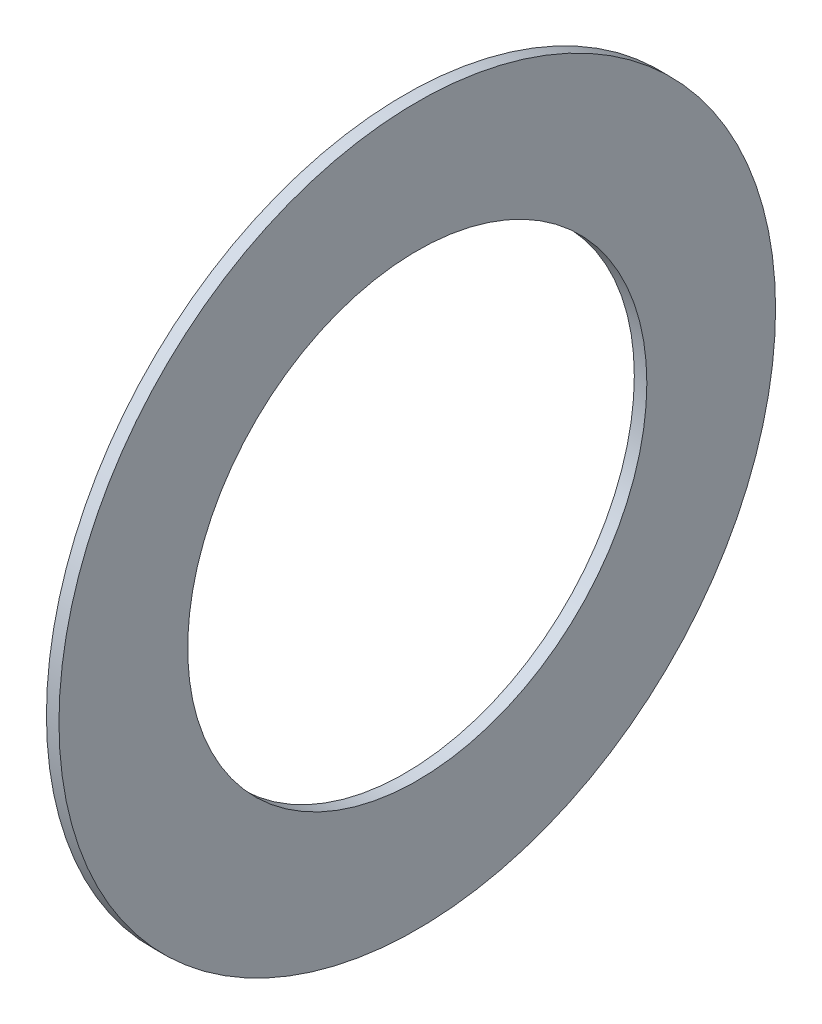
ISO-10303-21;
HEADER;
FILE_DESCRIPTION(('STEP AP214'),'2;1');
FILE_NAME('part.step','',(''),(''),'','','');
FILE_SCHEMA(('AUTOMOTIVE_DESIGN { 1 0 10303 214 1 1 1 1 }'));
ENDSEC;
DATA;
#1=APPLICATION_CONTEXT('core data for automotive mechanical design processes');
#2=APPLICATION_PROTOCOL_DEFINITION('international standard','automotive_design',2000,#1);
#3=PRODUCT_CONTEXT('',#1,'mechanical');
#4=PRODUCT('Part','Part','',(#3));
#5=PRODUCT_RELATED_PRODUCT_CATEGORY('part','',(#4));
#6=PRODUCT_DEFINITION_FORMATION('','',#4);
#7=PRODUCT_DEFINITION_CONTEXT('part definition',#1,'design');
#8=PRODUCT_DEFINITION('design','',#6,#7);
#9=PRODUCT_DEFINITION_SHAPE('','',#8);
#10=(LENGTH_UNIT() NAMED_UNIT(*) SI_UNIT(.MILLI.,.METRE.));
#11=(NAMED_UNIT(*) PLANE_ANGLE_UNIT() SI_UNIT($,.RADIAN.));
#12=(NAMED_UNIT(*) SI_UNIT($,.STERADIAN.) SOLID_ANGLE_UNIT());
#13=UNCERTAINTY_MEASURE_WITH_UNIT(LENGTH_MEASURE(1.E-05),#10,'distance_accuracy_value','');
#14=(GEOMETRIC_REPRESENTATION_CONTEXT(3) GLOBAL_UNCERTAINTY_ASSIGNED_CONTEXT((#13)) GLOBAL_UNIT_ASSIGNED_CONTEXT((#10,
#11,#12)) REPRESENTATION_CONTEXT('',''));
#15=CARTESIAN_POINT('',(0.,0.,0.));
#16=DIRECTION('',(0.,0.,1.));
#17=DIRECTION('',(1.,0.,0.));
#18=AXIS2_PLACEMENT_3D('',#15,#16,#17);
#19=CARTESIAN_POINT('',(0.2,0.,0.));
#20=DIRECTION('',(1.,0.,0.));
#21=DIRECTION('',(0.,0.,-1.));
#22=AXIS2_PLACEMENT_3D('',#19,#20,#21);
#23=CYLINDRICAL_SURFACE('',#22,5.72);
#24=CARTESIAN_POINT('',(0.,0.,0.));
#25=DIRECTION('',(1.,0.,0.));
#26=DIRECTION('',(0.,0.,-1.));
#27=AXIS2_PLACEMENT_3D('',#24,#25,#26);
#28=CIRCLE('',#27,5.72);
#29=CARTESIAN_POINT('',(0.,0.,-5.72));
#30=VERTEX_POINT('',#29);
#31=EDGE_CURVE('E29',#30,#30,#28,.T.);
#32=ORIENTED_EDGE('',*,*,#31,.T.);
#33=EDGE_LOOP('',(#32));
#34=FACE_BOUND('',#33,.T.);
#35=CARTESIAN_POINT('',(0.2,0.,0.));
#36=DIRECTION('',(1.,0.,0.));
#37=DIRECTION('',(0.,0.,-1.));
#38=AXIS2_PLACEMENT_3D('',#35,#36,#37);
#39=CIRCLE('',#38,5.72);
#40=CARTESIAN_POINT('',(0.2,0.,-5.72));
#41=VERTEX_POINT('',#40);
#42=EDGE_CURVE('E25',#41,#41,#39,.T.);
#43=ORIENTED_EDGE('',*,*,#42,.F.);
#44=EDGE_LOOP('',(#43));
#45=FACE_BOUND('',#44,.T.);
#46=ADVANCED_FACE('F14',(#34,#45),#23,.T.);
#47=CARTESIAN_POINT('',(0.,5.72,0.));
#48=DIRECTION('',(-1.,0.,0.));
#49=DIRECTION('',(0.,0.,1.));
#50=AXIS2_PLACEMENT_3D('',#47,#48,#49);
#51=PLANE('',#50);
#52=CARTESIAN_POINT('',(0.,0.,0.));
#53=DIRECTION('',(1.,0.,0.));
#54=DIRECTION('',(0.,0.,-1.));
#55=AXIS2_PLACEMENT_3D('',#52,#53,#54);
#56=CIRCLE('',#55,3.665);
#57=CARTESIAN_POINT('',(0.,0.,-3.665));
#58=VERTEX_POINT('',#57);
#59=EDGE_CURVE('E21',#58,#58,#56,.T.);
#60=ORIENTED_EDGE('',*,*,#59,.T.);
#61=EDGE_LOOP('',(#60));
#62=FACE_BOUND('',#61,.T.);
#63=ORIENTED_EDGE('',*,*,#31,.F.);
#64=EDGE_LOOP('',(#63));
#65=FACE_BOUND('',#64,.T.);
#66=ADVANCED_FACE('F37',(#62,#65),#51,.T.);
#67=CARTESIAN_POINT('',(0.2,3.665,0.));
#68=DIRECTION('',(1.,0.,0.));
#69=DIRECTION('',(0.,0.,-1.));
#70=AXIS2_PLACEMENT_3D('',#67,#68,#69);
#71=PLANE('',#70);
#72=ORIENTED_EDGE('',*,*,#42,.T.);
#73=EDGE_LOOP('',(#72));
#74=FACE_BOUND('',#73,.T.);
#75=CARTESIAN_POINT('',(0.2,0.,0.));
#76=DIRECTION('',(1.,0.,0.));
#77=DIRECTION('',(0.,0.,-1.));
#78=AXIS2_PLACEMENT_3D('',#75,#76,#77);
#79=CIRCLE('',#78,3.665);
#80=CARTESIAN_POINT('',(0.2,0.,-3.665));
#81=VERTEX_POINT('',#80);
#82=EDGE_CURVE('E9',#81,#81,#79,.T.);
#83=ORIENTED_EDGE('',*,*,#82,.F.);
#84=EDGE_LOOP('',(#83));
#85=FACE_BOUND('',#84,.T.);
#86=ADVANCED_FACE('F39',(#74,#85),#71,.T.);
#87=CARTESIAN_POINT('',(0.2,0.,0.));
#88=DIRECTION('',(1.,0.,0.));
#89=DIRECTION('',(0.,0.,-1.));
#90=AXIS2_PLACEMENT_3D('',#87,#88,#89);
#91=CYLINDRICAL_SURFACE('',#90,3.665);
#92=ORIENTED_EDGE('',*,*,#82,.T.);
#93=EDGE_LOOP('',(#92));
#94=FACE_BOUND('',#93,.T.);
#95=ORIENTED_EDGE('',*,*,#59,.F.);
#96=EDGE_LOOP('',(#95));
#97=FACE_BOUND('',#96,.T.);
#98=ADVANCED_FACE('F16',(#94,#97),#91,.F.);
#99=CLOSED_SHELL('',(#46,#66,#86,#98));
#100=MANIFOLD_SOLID_BREP('B1',#99);
#101=ADVANCED_BREP_SHAPE_REPRESENTATION('',(#18,#100),#14);
#102=SHAPE_DEFINITION_REPRESENTATION(#9,#101);
ENDSEC;
END-ISO-10303-21;
